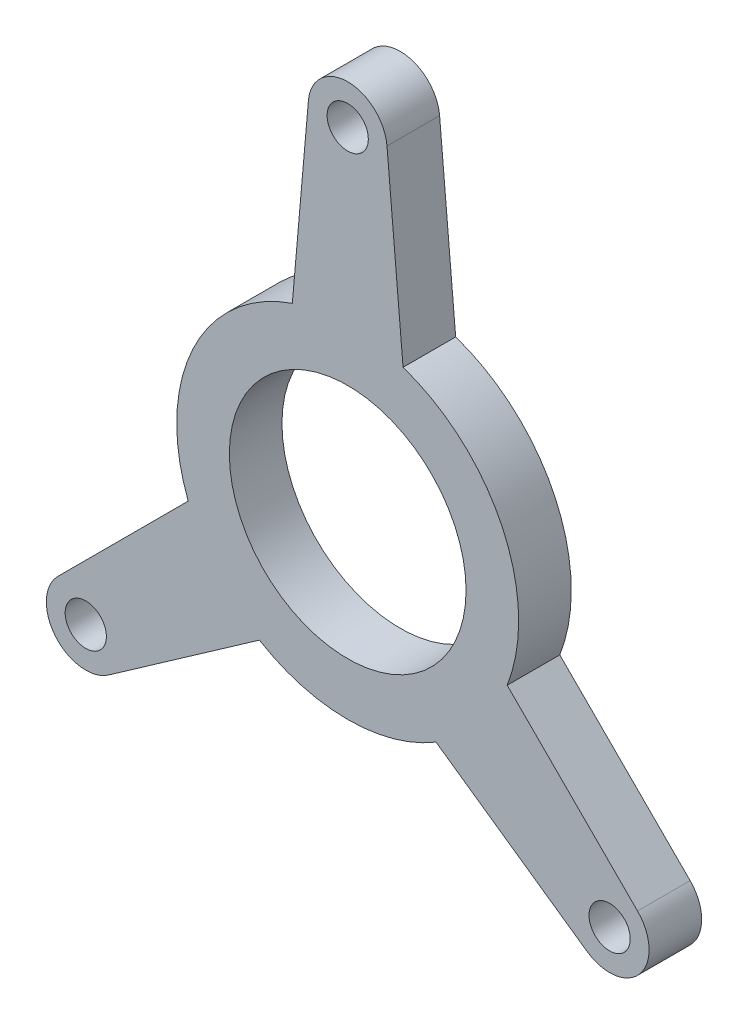
ISO-10303-21;
HEADER;
FILE_DESCRIPTION(('STEP AP214'),'2;1');
FILE_NAME('part.step','',(''),(''),'','','');
FILE_SCHEMA(('AUTOMOTIVE_DESIGN { 1 0 10303 214 1 1 1 1 }'));
ENDSEC;
DATA;
#1=APPLICATION_CONTEXT('core data for automotive mechanical design processes');
#2=APPLICATION_PROTOCOL_DEFINITION('international standard','automotive_design',2000,#1);
#3=PRODUCT_CONTEXT('',#1,'mechanical');
#4=PRODUCT('Part','Part','',(#3));
#5=PRODUCT_RELATED_PRODUCT_CATEGORY('part','',(#4));
#6=PRODUCT_DEFINITION_FORMATION('','',#4);
#7=PRODUCT_DEFINITION_CONTEXT('part definition',#1,'design');
#8=PRODUCT_DEFINITION('design','',#6,#7);
#9=PRODUCT_DEFINITION_SHAPE('','',#8);
#10=(LENGTH_UNIT() NAMED_UNIT(*) SI_UNIT(.MILLI.,.METRE.));
#11=(NAMED_UNIT(*) PLANE_ANGLE_UNIT() SI_UNIT($,.RADIAN.));
#12=(NAMED_UNIT(*) SI_UNIT($,.STERADIAN.) SOLID_ANGLE_UNIT());
#13=UNCERTAINTY_MEASURE_WITH_UNIT(LENGTH_MEASURE(1.E-05),#10,'distance_accuracy_value','');
#14=(GEOMETRIC_REPRESENTATION_CONTEXT(3) GLOBAL_UNCERTAINTY_ASSIGNED_CONTEXT((#13)) GLOBAL_UNIT_ASSIGNED_CONTEXT((#10,
#11,#12)) REPRESENTATION_CONTEXT('',''));
#15=CARTESIAN_POINT('',(0.,0.,0.));
#16=DIRECTION('',(0.,0.,1.));
#17=DIRECTION('',(1.,0.,0.));
#18=AXIS2_PLACEMENT_3D('',#15,#16,#17);
#19=CARTESIAN_POINT('',(0.,0.,3.175));
#20=DIRECTION('',(0.,0.,-1.));
#21=DIRECTION('',(-1.,0.,0.));
#22=AXIS2_PLACEMENT_3D('',#19,#20,#21);
#23=CYLINDRICAL_SURFACE('',#22,20.6375);
#24=CARTESIAN_POINT('',(0.,0.,-3.175));
#25=DIRECTION('',(0.,0.,1.));
#26=DIRECTION('',(1.,0.,0.));
#27=AXIS2_PLACEMENT_3D('',#24,#25,#26);
#28=CIRCLE('',#27,20.6375);
#29=CARTESIAN_POINT('',(19.2533338920293,-7.43071600130399,-3.175));
#30=VERTEX_POINT('',#29);
#31=CARTESIAN_POINT('',(6.68354576976034,19.525281616241,-3.175));
#32=VERTEX_POINT('',#31);
#33=EDGE_CURVE('E193',#30,#32,#28,.T.);
#34=ORIENTED_EDGE('',*,*,#33,.T.);
#35=DIRECTION('',(0.,0.,-1.));
#36=VECTOR('',#35,1.);
#37=CARTESIAN_POINT('',(6.68354576976034,19.525281616241,3.175));
#38=LINE('',#37,#36);
#39=CARTESIAN_POINT('',(6.68354576976034,19.525281616241,3.175));
#40=VERTEX_POINT('',#39);
#41=EDGE_CURVE('E11',#40,#32,#38,.T.);
#42=ORIENTED_EDGE('',*,*,#41,.F.);
#43=CARTESIAN_POINT('',(0.,0.,3.175));
#44=DIRECTION('',(0.,0.,1.));
#45=DIRECTION('',(1.,0.,0.));
#46=AXIS2_PLACEMENT_3D('',#43,#44,#45);
#47=CIRCLE('',#46,20.6375);
#48=CARTESIAN_POINT('',(19.2533338920293,-7.43071600130399,3.175));
#49=VERTEX_POINT('',#48);
#50=EDGE_CURVE('E116',#49,#40,#47,.T.);
#51=ORIENTED_EDGE('',*,*,#50,.F.);
#52=DIRECTION('',(0.,0.,-1.));
#53=VECTOR('',#52,1.);
#54=CARTESIAN_POINT('',(19.2533338920293,-7.43071600130399,3.175));
#55=LINE('',#54,#53);
#56=EDGE_CURVE('E188',#49,#30,#55,.T.);
#57=ORIENTED_EDGE('',*,*,#56,.T.);
#58=EDGE_LOOP('',(#34,#42,#51,#57));
#59=FACE_BOUND('',#58,.T.);
#60=ADVANCED_FACE('F47',(#59),#23,.T.);
#61=CARTESIAN_POINT('',(8.32804151626295,0.728609222046199,3.175));
#62=DIRECTION('',(0.996194698091746,0.0871557427476516,0.));
#63=DIRECTION('',(-0.0871557427476516,0.996194698091746,0.));
#64=AXIS2_PLACEMENT_3D('',#61,#62,#63);
#65=PLANE('',#64);
#66=DIRECTION('',(0.0871557427476516,-0.996194698091746,0.));
#67=VECTOR('',#66,1.);
#68=CARTESIAN_POINT('',(8.32804151626295,0.728609222046199,-3.175));
#69=LINE('',#68,#67);
#70=CARTESIAN_POINT('',(4.74437724966194,41.6900792248357,-3.175));
#71=VERTEX_POINT('',#70);
#72=EDGE_CURVE('E197',#71,#32,#69,.T.);
#73=ORIENTED_EDGE('',*,*,#72,.F.);
#74=DIRECTION('',(0.,0.,-1.));
#75=VECTOR('',#74,1.);
#76=CARTESIAN_POINT('',(4.74437724966194,41.6900792248357,3.175));
#77=LINE('',#76,#75);
#78=CARTESIAN_POINT('',(4.74437724966194,41.6900792248357,3.175));
#79=VERTEX_POINT('',#78);
#80=EDGE_CURVE('E57',#79,#71,#77,.T.);
#81=ORIENTED_EDGE('',*,*,#80,.F.);
#82=DIRECTION('',(0.0871557427476516,-0.996194698091746,0.));
#83=VECTOR('',#82,1.);
#84=CARTESIAN_POINT('',(8.32804151626295,0.728609222046199,3.175));
#85=LINE('',#84,#83);
#86=EDGE_CURVE('E283',#79,#40,#85,.T.);
#87=ORIENTED_EDGE('',*,*,#86,.T.);
#88=ORIENTED_EDGE('',*,*,#41,.T.);
#89=EDGE_LOOP('',(#73,#81,#87,#88));
#90=FACE_BOUND('',#89,.T.);
#91=ADVANCED_FACE('F282',(#90),#65,.T.);
#92=CARTESIAN_POINT('',(0.,41.275,3.175));
#93=DIRECTION('',(0.,0.,-1.));
#94=DIRECTION('',(-1.,0.,0.));
#95=AXIS2_PLACEMENT_3D('',#92,#93,#94);
#96=CYLINDRICAL_SURFACE('',#95,4.76250000000001);
#97=CARTESIAN_POINT('',(0.,41.275,-3.175));
#98=DIRECTION('',(0.,0.,1.));
#99=DIRECTION('',(1.,0.,0.));
#100=AXIS2_PLACEMENT_3D('',#97,#98,#99);
#101=CIRCLE('',#100,4.76250000000001);
#102=CARTESIAN_POINT('',(-4.74437724966194,41.6900792248357,-3.175));
#103=VERTEX_POINT('',#102);
#104=EDGE_CURVE('E203',#71,#103,#101,.T.);
#105=ORIENTED_EDGE('',*,*,#104,.T.);
#106=DIRECTION('',(0.,0.,-1.));
#107=VECTOR('',#106,1.);
#108=CARTESIAN_POINT('',(-4.74437724966194,41.6900792248357,3.175));
#109=LINE('',#108,#107);
#110=CARTESIAN_POINT('',(-4.74437724966194,41.6900792248357,3.175));
#111=VERTEX_POINT('',#110);
#112=EDGE_CURVE('E263',#111,#103,#109,.T.);
#113=ORIENTED_EDGE('',*,*,#112,.F.);
#114=CARTESIAN_POINT('',(0.,41.275,3.175));
#115=DIRECTION('',(0.,0.,1.));
#116=DIRECTION('',(1.,0.,0.));
#117=AXIS2_PLACEMENT_3D('',#114,#115,#116);
#118=CIRCLE('',#117,4.76250000000001);
#119=EDGE_CURVE('E272',#79,#111,#118,.T.);
#120=ORIENTED_EDGE('',*,*,#119,.F.);
#121=ORIENTED_EDGE('',*,*,#80,.T.);
#122=EDGE_LOOP('',(#105,#113,#120,#121));
#123=FACE_BOUND('',#122,.T.);
#124=ADVANCED_FACE('F270',(#123),#96,.T.);
#125=CARTESIAN_POINT('',(-8.32804151626294,0.728609222046197,3.175));
#126=DIRECTION('',(0.996194698091746,-0.0871557427476514,0.));
#127=DIRECTION('',(0.0871557427476514,0.996194698091746,0.));
#128=AXIS2_PLACEMENT_3D('',#125,#126,#127);
#129=PLANE('',#128);
#130=DIRECTION('',(-0.0871557427476514,-0.996194698091746,0.));
#131=VECTOR('',#130,1.);
#132=CARTESIAN_POINT('',(-8.32804151626294,0.728609222046197,-3.175));
#133=LINE('',#132,#131);
#134=CARTESIAN_POINT('',(-6.68354576976033,19.525281616241,-3.175));
#135=VERTEX_POINT('',#134);
#136=EDGE_CURVE('E206',#103,#135,#133,.T.);
#137=ORIENTED_EDGE('',*,*,#136,.T.);
#138=DIRECTION('',(0.,0.,-1.));
#139=VECTOR('',#138,1.);
#140=CARTESIAN_POINT('',(-6.68354576976033,19.525281616241,3.175));
#141=LINE('',#140,#139);
#142=CARTESIAN_POINT('',(-6.68354576976033,19.525281616241,3.175));
#143=VERTEX_POINT('',#142);
#144=EDGE_CURVE('E259',#143,#135,#141,.T.);
#145=ORIENTED_EDGE('',*,*,#144,.F.);
#146=DIRECTION('',(-0.0871557427476514,-0.996194698091746,0.));
#147=VECTOR('',#146,1.);
#148=CARTESIAN_POINT('',(-8.32804151626294,0.728609222046197,3.175));
#149=LINE('',#148,#147);
#150=EDGE_CURVE('E317',#111,#143,#149,.T.);
#151=ORIENTED_EDGE('',*,*,#150,.F.);
#152=ORIENTED_EDGE('',*,*,#112,.T.);
#153=EDGE_LOOP('',(#137,#145,#151,#152));
#154=FACE_BOUND('',#153,.T.);
#155=ADVANCED_FACE('F351',(#154),#129,.F.);
#156=CARTESIAN_POINT('',(-19.2533338920294,-7.43071600130374,-3.175));
#157=VERTEX_POINT('',#156);
#158=EDGE_CURVE('E199',#135,#157,#28,.T.);
#159=ORIENTED_EDGE('',*,*,#158,.T.);
#160=DIRECTION('',(0.,0.,-1.));
#161=VECTOR('',#160,1.);
#162=CARTESIAN_POINT('',(-19.2533338920294,-7.43071600130374,3.175));
#163=LINE('',#162,#161);
#164=CARTESIAN_POINT('',(-19.2533338920294,-7.43071600130374,3.175));
#165=VERTEX_POINT('',#164);
#166=EDGE_CURVE('E255',#165,#157,#163,.T.);
#167=ORIENTED_EDGE('',*,*,#166,.F.);
#168=EDGE_CURVE('E170',#143,#165,#47,.T.);
#169=ORIENTED_EDGE('',*,*,#168,.F.);
#170=ORIENTED_EDGE('',*,*,#144,.T.);
#171=EDGE_LOOP('',(#159,#167,#169,#170));
#172=FACE_BOUND('',#171,.T.);
#173=ADVANCED_FACE('F294',(#172),#23,.T.);
#174=CARTESIAN_POINT('',(-5.91130894536295,5.91130894536288,3.175));
#175=DIRECTION('',(0.707106781186552,-0.707106781186543,0.));
#176=DIRECTION('',(0.707106781186543,0.707106781186552,0.));
#177=AXIS2_PLACEMENT_3D('',#174,#175,#176);
#178=PLANE('',#177);
#179=DIRECTION('',(-0.707106781186543,-0.707106781186552,0.));
#180=VECTOR('',#179,1.);
#181=CARTESIAN_POINT('',(-5.91130894536295,5.91130894536288,-3.175));
#182=LINE('',#181,#180);
#183=CARTESIAN_POINT('',(-34.9860804351366,-23.1634625444111,-3.175));
#184=VERTEX_POINT('',#183);
#185=EDGE_CURVE('E209',#157,#184,#182,.T.);
#186=ORIENTED_EDGE('',*,*,#185,.T.);
#187=DIRECTION('',(0.,0.,-1.));
#188=VECTOR('',#187,1.);
#189=CARTESIAN_POINT('',(-34.9860804351366,-23.1634625444111,3.175));
#190=LINE('',#189,#188);
#191=CARTESIAN_POINT('',(-34.9860804351366,-23.1634625444111,3.175));
#192=VERTEX_POINT('',#191);
#193=EDGE_CURVE('E251',#192,#184,#190,.T.);
#194=ORIENTED_EDGE('',*,*,#193,.F.);
#195=DIRECTION('',(-0.707106781186543,-0.707106781186552,0.));
#196=VECTOR('',#195,1.);
#197=CARTESIAN_POINT('',(-5.91130894536295,5.91130894536288,3.175));
#198=LINE('',#197,#196);
#199=EDGE_CURVE('E302',#165,#192,#198,.T.);
#200=ORIENTED_EDGE('',*,*,#199,.F.);
#201=ORIENTED_EDGE('',*,*,#166,.T.);
#202=EDGE_LOOP('',(#186,#194,#200,#201));
#203=FACE_BOUND('',#202,.T.);
#204=ADVANCED_FACE('F300',(#203),#178,.F.);
#205=CARTESIAN_POINT('',(-31.6184843897357,-26.5310585898121,3.175));
#206=DIRECTION('',(0.,0.,-1.));
#207=DIRECTION('',(-1.,0.,0.));
#208=AXIS2_PLACEMENT_3D('',#205,#206,#207);
#209=CYLINDRICAL_SURFACE('',#208,4.7625);
#210=CARTESIAN_POINT('',(-31.6184843897357,-26.5310585898121,-3.175));
#211=DIRECTION('',(0.,0.,1.));
#212=DIRECTION('',(1.,0.,0.));
#213=AXIS2_PLACEMENT_3D('',#210,#211,#212);
#214=CIRCLE('',#213,4.7625);
#215=CARTESIAN_POINT('',(-28.8868266116138,-30.4322702007383,-3.175));
#216=VERTEX_POINT('',#215);
#217=EDGE_CURVE('E212',#184,#216,#214,.T.);
#218=ORIENTED_EDGE('',*,*,#217,.T.);
#219=DIRECTION('',(0.,0.,-1.));
#220=VECTOR('',#219,1.);
#221=CARTESIAN_POINT('',(-28.8868266116138,-30.4322702007383,3.175));
#222=LINE('',#221,#220);
#223=CARTESIAN_POINT('',(-28.8868266116138,-30.4322702007383,3.175));
#224=VERTEX_POINT('',#223);
#225=EDGE_CURVE('E247',#224,#216,#222,.T.);
#226=ORIENTED_EDGE('',*,*,#225,.F.);
#227=CARTESIAN_POINT('',(-31.6184843897357,-26.5310585898121,3.175));
#228=DIRECTION('',(0.,0.,1.));
#229=DIRECTION('',(1.,0.,0.));
#230=AXIS2_PLACEMENT_3D('',#227,#228,#229);
#231=CIRCLE('',#230,4.7625);
#232=EDGE_CURVE('E312',#192,#224,#231,.T.);
#233=ORIENTED_EDGE('',*,*,#232,.F.);
#234=ORIENTED_EDGE('',*,*,#193,.T.);
#235=EDGE_LOOP('',(#218,#226,#233,#234));
#236=FACE_BOUND('',#235,.T.);
#237=ADVANCED_FACE('F305',(#236),#209,.T.);
#238=CARTESIAN_POINT('',(4.79501485385509,-6.8479909058317,3.175));
#239=DIRECTION('',(-0.573576436351062,0.819152044288981,0.));
#240=DIRECTION('',(-0.819152044288981,-0.573576436351062,0.));
#241=AXIS2_PLACEMENT_3D('',#238,#239,#240);
#242=PLANE('',#241);
#243=DIRECTION('',(0.819152044288981,0.573576436351062,0.));
#244=VECTOR('',#243,1.);
#245=CARTESIAN_POINT('',(4.79501485385509,-6.8479909058317,-3.175));
#246=LINE('',#245,#244);
#247=CARTESIAN_POINT('',(-10.6611330728798,-17.6705021958163,-3.175));
#248=VERTEX_POINT('',#247);
#249=EDGE_CURVE('E215',#216,#248,#246,.T.);
#250=ORIENTED_EDGE('',*,*,#249,.T.);
#251=DIRECTION('',(0.,0.,-1.));
#252=VECTOR('',#251,1.);
#253=CARTESIAN_POINT('',(-10.6611330728798,-17.6705021958163,3.175));
#254=LINE('',#253,#252);
#255=CARTESIAN_POINT('',(-10.6611330728798,-17.6705021958163,3.175));
#256=VERTEX_POINT('',#255);
#257=EDGE_CURVE('E243',#256,#248,#254,.T.);
#258=ORIENTED_EDGE('',*,*,#257,.F.);
#259=DIRECTION('',(0.819152044288981,0.573576436351062,0.));
#260=VECTOR('',#259,1.);
#261=CARTESIAN_POINT('',(4.79501485385509,-6.8479909058317,3.175));
#262=LINE('',#261,#260);
#263=EDGE_CURVE('E168',#224,#256,#262,.T.);
#264=ORIENTED_EDGE('',*,*,#263,.F.);
#265=ORIENTED_EDGE('',*,*,#225,.T.);
#266=EDGE_LOOP('',(#250,#258,#264,#265));
#267=FACE_BOUND('',#266,.T.);
#268=ADVANCED_FACE('F309',(#267),#242,.F.);
#269=CARTESIAN_POINT('',(10.6611330728796,-17.6705021958164,-3.175));
#270=VERTEX_POINT('',#269);
#271=EDGE_CURVE('E198',#248,#270,#28,.T.);
#272=ORIENTED_EDGE('',*,*,#271,.T.);
#273=DIRECTION('',(0.,0.,-1.));
#274=VECTOR('',#273,1.);
#275=CARTESIAN_POINT('',(10.6611330728796,-17.6705021958164,3.175));
#276=LINE('',#275,#274);
#277=CARTESIAN_POINT('',(10.6611330728796,-17.6705021958164,3.175));
#278=VERTEX_POINT('',#277);
#279=EDGE_CURVE('E153',#278,#270,#276,.T.);
#280=ORIENTED_EDGE('',*,*,#279,.F.);
#281=EDGE_CURVE('E163',#256,#278,#47,.T.);
#282=ORIENTED_EDGE('',*,*,#281,.F.);
#283=ORIENTED_EDGE('',*,*,#257,.T.);
#284=EDGE_LOOP('',(#272,#280,#282,#283));
#285=FACE_BOUND('',#284,.T.);
#286=ADVANCED_FACE('F344',(#285),#23,.T.);
#287=CARTESIAN_POINT('',(-4.79501485385526,-6.84799090583208,3.175));
#288=DIRECTION('',(-0.573576436351054,-0.819152044288986,0.));
#289=DIRECTION('',(0.819152044288986,-0.573576436351054,0.));
#290=AXIS2_PLACEMENT_3D('',#287,#288,#289);
#291=PLANE('',#290);
#292=DIRECTION('',(-0.819152044288987,0.573576436351054,0.));
#293=VECTOR('',#292,1.);
#294=CARTESIAN_POINT('',(-4.79501485385526,-6.84799090583208,-3.175));
#295=LINE('',#294,#293);
#296=CARTESIAN_POINT('',(28.8868266116138,-30.4322702007384,-3.175));
#297=VERTEX_POINT('',#296);
#298=EDGE_CURVE('E151',#297,#270,#295,.T.);
#299=ORIENTED_EDGE('',*,*,#298,.F.);
#300=DIRECTION('',(0.,0.,-1.));
#301=VECTOR('',#300,1.);
#302=CARTESIAN_POINT('',(28.8868266116138,-30.4322702007384,3.175));
#303=LINE('',#302,#301);
#304=CARTESIAN_POINT('',(28.8868266116138,-30.4322702007384,3.175));
#305=VERTEX_POINT('',#304);
#306=EDGE_CURVE('E145',#305,#297,#303,.T.);
#307=ORIENTED_EDGE('',*,*,#306,.F.);
#308=DIRECTION('',(-0.819152044288987,0.573576436351054,0.));
#309=VECTOR('',#308,1.);
#310=CARTESIAN_POINT('',(-4.79501485385526,-6.84799090583208,3.175));
#311=LINE('',#310,#309);
#312=EDGE_CURVE('E149',#305,#278,#311,.T.);
#313=ORIENTED_EDGE('',*,*,#312,.T.);
#314=ORIENTED_EDGE('',*,*,#279,.T.);
#315=EDGE_LOOP('',(#299,#307,#313,#314));
#316=FACE_BOUND('',#315,.T.);
#317=ADVANCED_FACE('F147',(#316),#291,.T.);
#318=CARTESIAN_POINT('',(31.6184843897357,-26.5310585898121,3.175));
#319=DIRECTION('',(0.,0.,-1.));
#320=DIRECTION('',(-1.,0.,0.));
#321=AXIS2_PLACEMENT_3D('',#318,#319,#320);
#322=CYLINDRICAL_SURFACE('',#321,4.76250000000001);
#323=CARTESIAN_POINT('',(31.6184843897357,-26.5310585898121,-3.175));
#324=DIRECTION('',(0.,0.,1.));
#325=DIRECTION('',(1.,0.,0.));
#326=AXIS2_PLACEMENT_3D('',#323,#324,#325);
#327=CIRCLE('',#326,4.76250000000001);
#328=CARTESIAN_POINT('',(34.9860804351366,-23.1634625444111,-3.175));
#329=VERTEX_POINT('',#328);
#330=EDGE_CURVE('E104',#297,#329,#327,.T.);
#331=ORIENTED_EDGE('',*,*,#330,.T.);
#332=DIRECTION('',(0.,0.,-1.));
#333=VECTOR('',#332,1.);
#334=CARTESIAN_POINT('',(34.9860804351366,-23.1634625444111,3.175));
#335=LINE('',#334,#333);
#336=CARTESIAN_POINT('',(34.9860804351366,-23.1634625444111,3.175));
#337=VERTEX_POINT('',#336);
#338=EDGE_CURVE('E154',#337,#329,#335,.T.);
#339=ORIENTED_EDGE('',*,*,#338,.F.);
#340=CARTESIAN_POINT('',(31.6184843897357,-26.5310585898121,3.175));
#341=DIRECTION('',(0.,0.,1.));
#342=DIRECTION('',(1.,0.,0.));
#343=AXIS2_PLACEMENT_3D('',#340,#341,#342);
#344=CIRCLE('',#343,4.76250000000001);
#345=EDGE_CURVE('E156',#305,#337,#344,.T.);
#346=ORIENTED_EDGE('',*,*,#345,.F.);
#347=ORIENTED_EDGE('',*,*,#306,.T.);
#348=EDGE_LOOP('',(#331,#339,#346,#347));
#349=FACE_BOUND('',#348,.T.);
#350=ADVANCED_FACE('F157',(#349),#322,.T.);
#351=CARTESIAN_POINT('',(-31.6184843897357,-26.5310585898121,3.175));
#352=DIRECTION('',(0.,0.,-1.));
#353=DIRECTION('',(-1.,0.,0.));
#354=AXIS2_PLACEMENT_3D('',#351,#352,#353);
#355=CYLINDRICAL_SURFACE('',#354,2.4892);
#356=CARTESIAN_POINT('',(-31.6184843897357,-26.5310585898121,3.175));
#357=DIRECTION('',(0.,0.,1.));
#358=DIRECTION('',(1.,0.,0.));
#359=AXIS2_PLACEMENT_3D('',#356,#357,#358);
#360=CIRCLE('',#359,2.4892);
#361=CARTESIAN_POINT('',(-29.1292843897357,-26.5310585898121,3.175));
#362=VERTEX_POINT('',#361);
#363=EDGE_CURVE('E180',#362,#362,#360,.T.);
#364=ORIENTED_EDGE('',*,*,#363,.T.);
#365=EDGE_LOOP('',(#364));
#366=FACE_BOUND('',#365,.T.);
#367=CARTESIAN_POINT('',(-31.6184843897357,-26.5310585898121,-3.175));
#368=DIRECTION('',(0.,0.,1.));
#369=DIRECTION('',(1.,0.,0.));
#370=AXIS2_PLACEMENT_3D('',#367,#368,#369);
#371=CIRCLE('',#370,2.4892);
#372=CARTESIAN_POINT('',(-29.1292843897357,-26.5310585898121,-3.175));
#373=VERTEX_POINT('',#372);
#374=EDGE_CURVE('E228',#373,#373,#371,.T.);
#375=ORIENTED_EDGE('',*,*,#374,.F.);
#376=EDGE_LOOP('',(#375));
#377=FACE_BOUND('',#376,.T.);
#378=ADVANCED_FACE('F416',(#366,#377),#355,.F.);
#379=CARTESIAN_POINT('',(0.,41.275,3.175));
#380=DIRECTION('',(0.,0.,-1.));
#381=DIRECTION('',(-1.,0.,0.));
#382=AXIS2_PLACEMENT_3D('',#379,#380,#381);
#383=CYLINDRICAL_SURFACE('',#382,2.48920000000001);
#384=CARTESIAN_POINT('',(0.,41.275,3.175));
#385=DIRECTION('',(0.,0.,1.));
#386=DIRECTION('',(1.,0.,0.));
#387=AXIS2_PLACEMENT_3D('',#384,#385,#386);
#388=CIRCLE('',#387,2.48920000000001);
#389=CARTESIAN_POINT('',(2.48920000000001,41.275,3.175));
#390=VERTEX_POINT('',#389);
#391=EDGE_CURVE('E176',#390,#390,#388,.T.);
#392=ORIENTED_EDGE('',*,*,#391,.T.);
#393=EDGE_LOOP('',(#392));
#394=FACE_BOUND('',#393,.T.);
#395=CARTESIAN_POINT('',(0.,41.275,-3.175));
#396=DIRECTION('',(0.,0.,1.));
#397=DIRECTION('',(1.,0.,0.));
#398=AXIS2_PLACEMENT_3D('',#395,#396,#397);
#399=CIRCLE('',#398,2.48920000000001);
#400=CARTESIAN_POINT('',(2.48920000000001,41.275,-3.175));
#401=VERTEX_POINT('',#400);
#402=EDGE_CURVE('E224',#401,#401,#399,.T.);
#403=ORIENTED_EDGE('',*,*,#402,.F.);
#404=EDGE_LOOP('',(#403));
#405=FACE_BOUND('',#404,.T.);
#406=ADVANCED_FACE('F425',(#394,#405),#383,.F.);
#407=CARTESIAN_POINT('',(5.91130894536256,5.91130894536262,3.175));
#408=DIRECTION('',(-0.707106781186544,-0.707106781186551,0.));
#409=DIRECTION('',(0.707106781186551,-0.707106781186544,0.));
#410=AXIS2_PLACEMENT_3D('',#407,#408,#409);
#411=PLANE('',#410);
#412=DIRECTION('',(-0.707106781186551,0.707106781186544,0.));
#413=VECTOR('',#412,1.);
#414=CARTESIAN_POINT('',(5.91130894536256,5.91130894536262,-3.175));
#415=LINE('',#414,#413);
#416=EDGE_CURVE('E110',#329,#30,#415,.T.);
#417=ORIENTED_EDGE('',*,*,#416,.T.);
#418=ORIENTED_EDGE('',*,*,#56,.F.);
#419=DIRECTION('',(-0.707106781186551,0.707106781186544,0.));
#420=VECTOR('',#419,1.);
#421=CARTESIAN_POINT('',(5.91130894536256,5.91130894536262,3.175));
#422=LINE('',#421,#420);
#423=EDGE_CURVE('E65',#337,#49,#422,.T.);
#424=ORIENTED_EDGE('',*,*,#423,.F.);
#425=ORIENTED_EDGE('',*,*,#338,.T.);
#426=EDGE_LOOP('',(#417,#418,#424,#425));
#427=FACE_BOUND('',#426,.T.);
#428=ADVANCED_FACE('F435',(#427),#411,.F.);
#429=CARTESIAN_POINT('',(0.,0.,3.175));
#430=DIRECTION('',(0.,0.,-1.));
#431=DIRECTION('',(-1.,0.,0.));
#432=AXIS2_PLACEMENT_3D('',#429,#430,#431);
#433=CYLINDRICAL_SURFACE('',#432,14.2875);
#434=CARTESIAN_POINT('',(0.,0.,3.175));
#435=DIRECTION('',(0.,0.,1.));
#436=DIRECTION('',(1.,0.,0.));
#437=AXIS2_PLACEMENT_3D('',#434,#435,#436);
#438=CIRCLE('',#437,14.2875);
#439=CARTESIAN_POINT('',(14.2875,0.,3.175));
#440=VERTEX_POINT('',#439);
#441=EDGE_CURVE('E236',#440,#440,#438,.T.);
#442=ORIENTED_EDGE('',*,*,#441,.T.);
#443=EDGE_LOOP('',(#442));
#444=FACE_BOUND('',#443,.T.);
#445=CARTESIAN_POINT('',(0.,0.,-3.175));
#446=DIRECTION('',(0.,0.,1.));
#447=DIRECTION('',(1.,0.,0.));
#448=AXIS2_PLACEMENT_3D('',#445,#446,#447);
#449=CIRCLE('',#448,14.2875);
#450=CARTESIAN_POINT('',(14.2875,0.,-3.175));
#451=VERTEX_POINT('',#450);
#452=EDGE_CURVE('E189',#451,#451,#449,.T.);
#453=ORIENTED_EDGE('',*,*,#452,.F.);
#454=EDGE_LOOP('',(#453));
#455=FACE_BOUND('',#454,.T.);
#456=ADVANCED_FACE('F49',(#444,#455),#433,.F.);
#457=CARTESIAN_POINT('',(31.6184843897357,-26.5310585898121,3.175));
#458=DIRECTION('',(0.,0.,-1.));
#459=DIRECTION('',(-1.,0.,0.));
#460=AXIS2_PLACEMENT_3D('',#457,#458,#459);
#461=CYLINDRICAL_SURFACE('',#460,2.4892);
#462=CARTESIAN_POINT('',(31.6184843897357,-26.5310585898121,3.175));
#463=DIRECTION('',(0.,0.,1.));
#464=DIRECTION('',(1.,0.,0.));
#465=AXIS2_PLACEMENT_3D('',#462,#463,#464);
#466=CIRCLE('',#465,2.4892);
#467=CARTESIAN_POINT('',(34.1076843897357,-26.5310585898121,3.175));
#468=VERTEX_POINT('',#467);
#469=EDGE_CURVE('E184',#468,#468,#466,.T.);
#470=ORIENTED_EDGE('',*,*,#469,.T.);
#471=EDGE_LOOP('',(#470));
#472=FACE_BOUND('',#471,.T.);
#473=CARTESIAN_POINT('',(31.6184843897357,-26.5310585898121,-3.175));
#474=DIRECTION('',(0.,0.,1.));
#475=DIRECTION('',(1.,0.,0.));
#476=AXIS2_PLACEMENT_3D('',#473,#474,#475);
#477=CIRCLE('',#476,2.4892);
#478=CARTESIAN_POINT('',(34.1076843897357,-26.5310585898121,-3.175));
#479=VERTEX_POINT('',#478);
#480=EDGE_CURVE('E232',#479,#479,#477,.T.);
#481=ORIENTED_EDGE('',*,*,#480,.F.);
#482=EDGE_LOOP('',(#481));
#483=FACE_BOUND('',#482,.T.);
#484=ADVANCED_FACE('F332',(#472,#483),#461,.F.);
#485=CARTESIAN_POINT('',(0.,0.,3.175));
#486=DIRECTION('',(0.,0.,1.));
#487=DIRECTION('',(1.,0.,0.));
#488=AXIS2_PLACEMENT_3D('',#485,#486,#487);
#489=PLANE('',#488);
#490=ORIENTED_EDGE('',*,*,#441,.F.);
#491=EDGE_LOOP('',(#490));
#492=FACE_BOUND('',#491,.T.);
#493=ORIENTED_EDGE('',*,*,#50,.T.);
#494=ORIENTED_EDGE('',*,*,#86,.F.);
#495=ORIENTED_EDGE('',*,*,#119,.T.);
#496=ORIENTED_EDGE('',*,*,#150,.T.);
#497=ORIENTED_EDGE('',*,*,#168,.T.);
#498=ORIENTED_EDGE('',*,*,#199,.T.);
#499=ORIENTED_EDGE('',*,*,#232,.T.);
#500=ORIENTED_EDGE('',*,*,#263,.T.);
#501=ORIENTED_EDGE('',*,*,#281,.T.);
#502=ORIENTED_EDGE('',*,*,#312,.F.);
#503=ORIENTED_EDGE('',*,*,#345,.T.);
#504=ORIENTED_EDGE('',*,*,#423,.T.);
#505=EDGE_LOOP('',(#493,#494,#495,#496,#497,#498,#499,#500,#501,#502,#503,#504));
#506=FACE_BOUND('',#505,.T.);
#507=ORIENTED_EDGE('',*,*,#391,.F.);
#508=EDGE_LOOP('',(#507));
#509=FACE_BOUND('',#508,.T.);
#510=ORIENTED_EDGE('',*,*,#363,.F.);
#511=EDGE_LOOP('',(#510));
#512=FACE_BOUND('',#511,.T.);
#513=ORIENTED_EDGE('',*,*,#469,.F.);
#514=EDGE_LOOP('',(#513));
#515=FACE_BOUND('',#514,.T.);
#516=ADVANCED_FACE('F160',(#492,#506,#509,#512,#515),#489,.T.);
#517=CARTESIAN_POINT('',(0.,0.,-3.175));
#518=DIRECTION('',(0.,0.,1.));
#519=DIRECTION('',(1.,0.,0.));
#520=AXIS2_PLACEMENT_3D('',#517,#518,#519);
#521=PLANE('',#520);
#522=ORIENTED_EDGE('',*,*,#452,.T.);
#523=EDGE_LOOP('',(#522));
#524=FACE_BOUND('',#523,.T.);
#525=ORIENTED_EDGE('',*,*,#33,.F.);
#526=ORIENTED_EDGE('',*,*,#416,.F.);
#527=ORIENTED_EDGE('',*,*,#330,.F.);
#528=ORIENTED_EDGE('',*,*,#298,.T.);
#529=ORIENTED_EDGE('',*,*,#271,.F.);
#530=ORIENTED_EDGE('',*,*,#249,.F.);
#531=ORIENTED_EDGE('',*,*,#217,.F.);
#532=ORIENTED_EDGE('',*,*,#185,.F.);
#533=ORIENTED_EDGE('',*,*,#158,.F.);
#534=ORIENTED_EDGE('',*,*,#136,.F.);
#535=ORIENTED_EDGE('',*,*,#104,.F.);
#536=ORIENTED_EDGE('',*,*,#72,.T.);
#537=EDGE_LOOP('',(#525,#526,#527,#528,#529,#530,#531,#532,#533,#534,#535,#536));
#538=FACE_BOUND('',#537,.T.);
#539=ORIENTED_EDGE('',*,*,#402,.T.);
#540=EDGE_LOOP('',(#539));
#541=FACE_BOUND('',#540,.T.);
#542=ORIENTED_EDGE('',*,*,#374,.T.);
#543=EDGE_LOOP('',(#542));
#544=FACE_BOUND('',#543,.T.);
#545=ORIENTED_EDGE('',*,*,#480,.T.);
#546=EDGE_LOOP('',(#545));
#547=FACE_BOUND('',#546,.T.);
#548=ADVANCED_FACE('F279',(#524,#538,#541,#544,#547),#521,.F.);
#549=CLOSED_SHELL('',(#60,#91,#124,#155,#173,#204,#237,#268,#286,#317,#350,#378,#406,#428,#456,
#484,#516,#548));
#550=MANIFOLD_SOLID_BREP('B2',#549);
#551=ADVANCED_BREP_SHAPE_REPRESENTATION('',(#18,#550),#14);
#552=SHAPE_DEFINITION_REPRESENTATION(#9,#551);
ENDSEC;
END-ISO-10303-21;
